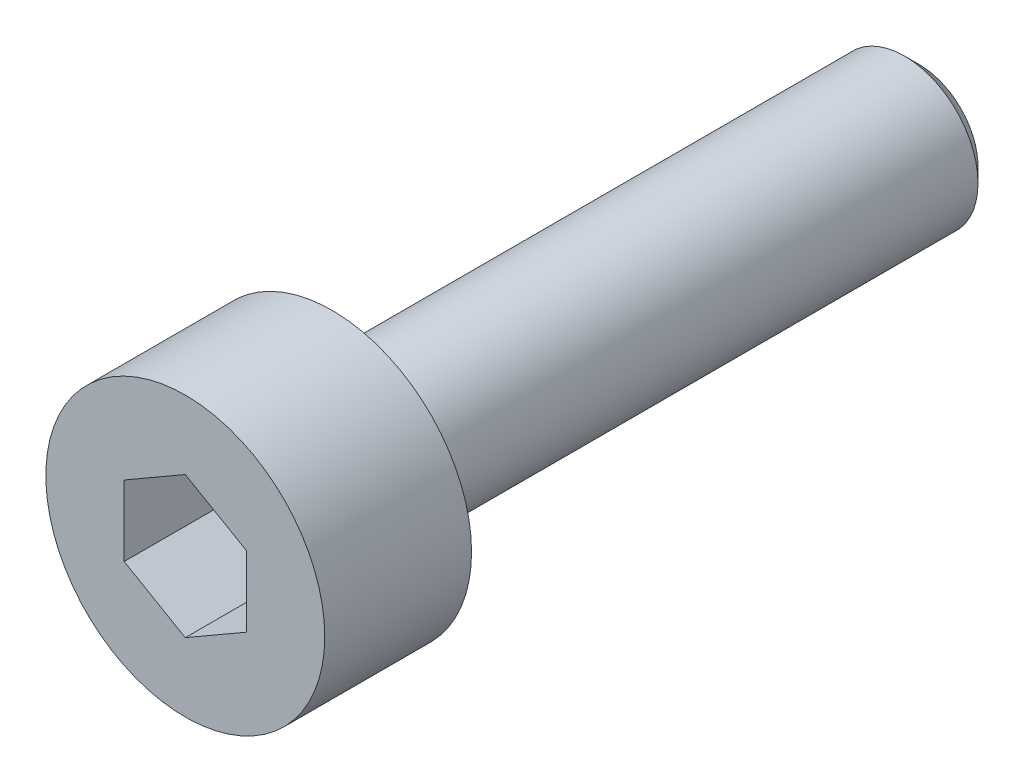
ISO-10303-21;
HEADER;
FILE_DESCRIPTION(('STEP AP214'),'2;1');
FILE_NAME('part.step','',(''),(''),'','','');
FILE_SCHEMA(('AUTOMOTIVE_DESIGN { 1 0 10303 214 1 1 1 1 }'));
ENDSEC;
DATA;
#1=APPLICATION_CONTEXT('core data for automotive mechanical design processes');
#2=APPLICATION_PROTOCOL_DEFINITION('international standard','automotive_design',2000,#1);
#3=PRODUCT_CONTEXT('',#1,'mechanical');
#4=PRODUCT('Part','Part','',(#3));
#5=PRODUCT_RELATED_PRODUCT_CATEGORY('part','',(#4));
#6=PRODUCT_DEFINITION_FORMATION('','',#4);
#7=PRODUCT_DEFINITION_CONTEXT('part definition',#1,'design');
#8=PRODUCT_DEFINITION('design','',#6,#7);
#9=PRODUCT_DEFINITION_SHAPE('','',#8);
#10=(LENGTH_UNIT() NAMED_UNIT(*) SI_UNIT(.MILLI.,.METRE.));
#11=(NAMED_UNIT(*) PLANE_ANGLE_UNIT() SI_UNIT($,.RADIAN.));
#12=(NAMED_UNIT(*) SI_UNIT($,.STERADIAN.) SOLID_ANGLE_UNIT());
#13=UNCERTAINTY_MEASURE_WITH_UNIT(LENGTH_MEASURE(1.E-05),#10,'distance_accuracy_value','');
#14=(GEOMETRIC_REPRESENTATION_CONTEXT(3) GLOBAL_UNCERTAINTY_ASSIGNED_CONTEXT((#13)) GLOBAL_UNIT_ASSIGNED_CONTEXT((#10,
#11,#12)) REPRESENTATION_CONTEXT('',''));
#15=CARTESIAN_POINT('',(0.,0.,0.));
#16=DIRECTION('',(0.,0.,1.));
#17=DIRECTION('',(1.,0.,0.));
#18=AXIS2_PLACEMENT_3D('',#15,#16,#17);
#19=CARTESIAN_POINT('',(0.,0.,0.));
#20=DIRECTION('',(0.,0.,1.));
#21=DIRECTION('',(1.,0.,0.));
#22=AXIS2_PLACEMENT_3D('',#19,#20,#21);
#23=PLANE('',#22);
#24=CARTESIAN_POINT('',(0.,0.,0.));
#25=DIRECTION('',(0.,0.,1.));
#26=DIRECTION('',(1.,0.,0.));
#27=AXIS2_PLACEMENT_3D('',#24,#25,#26);
#28=CIRCLE('',#27,2.85);
#29=CARTESIAN_POINT('',(2.85,0.,0.));
#30=VERTEX_POINT('',#29);
#31=EDGE_CURVE('E140',#30,#30,#28,.T.);
#32=ORIENTED_EDGE('',*,*,#31,.F.);
#33=EDGE_LOOP('',(#32));
#34=FACE_BOUND('',#33,.T.);
#35=CARTESIAN_POINT('',(0.,0.,0.));
#36=DIRECTION('',(0.,0.,1.));
#37=DIRECTION('',(1.,0.,0.));
#38=AXIS2_PLACEMENT_3D('',#35,#36,#37);
#39=CIRCLE('',#38,1.5);
#40=CARTESIAN_POINT('',(1.5,0.,0.));
#41=VERTEX_POINT('',#40);
#42=EDGE_CURVE('E149',#41,#41,#39,.F.);
#43=ORIENTED_EDGE('',*,*,#42,.F.);
#44=EDGE_LOOP('',(#43));
#45=FACE_BOUND('',#44,.T.);
#46=ADVANCED_FACE('F38',(#34,#45),#23,.F.);
#47=CARTESIAN_POINT('',(0.,0.,3.));
#48=DIRECTION('',(0.,0.,-1.));
#49=DIRECTION('',(-1.,0.,0.));
#50=AXIS2_PLACEMENT_3D('',#47,#48,#49);
#51=CYLINDRICAL_SURFACE('',#50,2.85);
#52=CARTESIAN_POINT('',(0.,0.,3.));
#53=DIRECTION('',(0.,0.,1.));
#54=DIRECTION('',(1.,0.,0.));
#55=AXIS2_PLACEMENT_3D('',#52,#53,#54);
#56=CIRCLE('',#55,2.85);
#57=CARTESIAN_POINT('',(2.85,0.,3.));
#58=VERTEX_POINT('',#57);
#59=EDGE_CURVE('E146',#58,#58,#56,.T.);
#60=ORIENTED_EDGE('',*,*,#59,.F.);
#61=EDGE_LOOP('',(#60));
#62=FACE_BOUND('',#61,.T.);
#63=ORIENTED_EDGE('',*,*,#31,.T.);
#64=EDGE_LOOP('',(#63));
#65=FACE_BOUND('',#64,.T.);
#66=ADVANCED_FACE('F171',(#62,#65),#51,.T.);
#67=CARTESIAN_POINT('',(0.,0.,3.));
#68=DIRECTION('',(0.,0.,1.));
#69=DIRECTION('',(1.,0.,0.));
#70=AXIS2_PLACEMENT_3D('',#67,#68,#69);
#71=PLANE('',#70);
#72=DIRECTION('',(-0.866025403784439,0.5,0.));
#73=VECTOR('',#72,1.);
#74=CARTESIAN_POINT('',(1.25,0.721687836487032,3.));
#75=LINE('',#74,#73);
#76=CARTESIAN_POINT('',(1.25,0.721687836487032,3.));
#77=VERTEX_POINT('',#76);
#78=CARTESIAN_POINT('',(0.,1.44337567297406,3.));
#79=VERTEX_POINT('',#78);
#80=EDGE_CURVE('E53',#77,#79,#75,.T.);
#81=ORIENTED_EDGE('',*,*,#80,.F.);
#82=DIRECTION('',(0.,1.,0.));
#83=VECTOR('',#82,1.);
#84=CARTESIAN_POINT('',(1.25,-0.721687836487032,3.));
#85=LINE('',#84,#83);
#86=CARTESIAN_POINT('',(1.25,-0.721687836487032,3.));
#87=VERTEX_POINT('',#86);
#88=EDGE_CURVE('E136',#87,#77,#85,.T.);
#89=ORIENTED_EDGE('',*,*,#88,.F.);
#90=DIRECTION('',(0.866025403784439,0.5,0.));
#91=VECTOR('',#90,1.);
#92=CARTESIAN_POINT('',(0.,-1.44337567297406,3.));
#93=LINE('',#92,#91);
#94=CARTESIAN_POINT('',(0.,-1.44337567297406,3.));
#95=VERTEX_POINT('',#94);
#96=EDGE_CURVE('E134',#95,#87,#93,.T.);
#97=ORIENTED_EDGE('',*,*,#96,.F.);
#98=DIRECTION('',(0.866025403784439,-0.5,0.));
#99=VECTOR('',#98,1.);
#100=CARTESIAN_POINT('',(-1.25,-0.721687836487033,3.));
#101=LINE('',#100,#99);
#102=CARTESIAN_POINT('',(-1.25,-0.721687836487033,3.));
#103=VERTEX_POINT('',#102);
#104=EDGE_CURVE('E101',#103,#95,#101,.T.);
#105=ORIENTED_EDGE('',*,*,#104,.F.);
#106=DIRECTION('',(0.,-1.,0.));
#107=VECTOR('',#106,1.);
#108=CARTESIAN_POINT('',(-1.25,0.721687836487032,3.));
#109=LINE('',#108,#107);
#110=CARTESIAN_POINT('',(-1.25,0.721687836487032,3.));
#111=VERTEX_POINT('',#110);
#112=EDGE_CURVE('E130',#111,#103,#109,.T.);
#113=ORIENTED_EDGE('',*,*,#112,.F.);
#114=DIRECTION('',(-0.866025403784439,-0.5,0.));
#115=VECTOR('',#114,1.);
#116=CARTESIAN_POINT('',(0.,1.44337567297406,3.));
#117=LINE('',#116,#115);
#118=EDGE_CURVE('E127',#79,#111,#117,.T.);
#119=ORIENTED_EDGE('',*,*,#118,.F.);
#120=EDGE_LOOP('',(#81,#89,#97,#105,#113,#119));
#121=FACE_BOUND('',#120,.T.);
#122=ORIENTED_EDGE('',*,*,#59,.T.);
#123=EDGE_LOOP('',(#122));
#124=FACE_BOUND('',#123,.T.);
#125=ADVANCED_FACE('F177',(#121,#124),#71,.T.);
#126=CARTESIAN_POINT('',(0.,0.,-12.));
#127=DIRECTION('',(0.,0.,1.));
#128=DIRECTION('',(1.,0.,0.));
#129=AXIS2_PLACEMENT_3D('',#126,#127,#128);
#130=CYLINDRICAL_SURFACE('',#129,1.5);
#131=CARTESIAN_POINT('',(0.,0.,-11.7));
#132=DIRECTION('',(0.,0.,-1.));
#133=DIRECTION('',(-1.,0.,0.));
#134=AXIS2_PLACEMENT_3D('',#131,#132,#133);
#135=CIRCLE('',#134,1.5);
#136=CARTESIAN_POINT('',(-1.5,0.,-11.7));
#137=VERTEX_POINT('',#136);
#138=EDGE_CURVE('E11',#137,#137,#135,.F.);
#139=ORIENTED_EDGE('',*,*,#138,.T.);
#140=EDGE_LOOP('',(#139));
#141=FACE_BOUND('',#140,.T.);
#142=ORIENTED_EDGE('',*,*,#42,.T.);
#143=EDGE_LOOP('',(#142));
#144=FACE_BOUND('',#143,.T.);
#145=ADVANCED_FACE('F167',(#141,#144),#130,.T.);
#146=CARTESIAN_POINT('',(0.,0.,-12.));
#147=DIRECTION('',(0.,0.,-1.));
#148=DIRECTION('',(-1.,0.,0.));
#149=AXIS2_PLACEMENT_3D('',#146,#147,#148);
#150=PLANE('',#149);
#151=CARTESIAN_POINT('',(0.,0.,-12.));
#152=DIRECTION('',(0.,0.,-1.));
#153=DIRECTION('',(-1.,0.,0.));
#154=AXIS2_PLACEMENT_3D('',#151,#152,#153);
#155=CIRCLE('',#154,1.2);
#156=CARTESIAN_POINT('',(-1.2,0.,-12.));
#157=VERTEX_POINT('',#156);
#158=EDGE_CURVE('E46',#157,#157,#155,.T.);
#159=ORIENTED_EDGE('',*,*,#158,.T.);
#160=EDGE_LOOP('',(#159));
#161=FACE_BOUND('',#160,.T.);
#162=ADVANCED_FACE('F156',(#161),#150,.T.);
#163=CARTESIAN_POINT('',(0.,0.,-12.));
#164=DIRECTION('',(0.,0.,1.));
#165=DIRECTION('',(1.,0.,0.));
#166=AXIS2_PLACEMENT_3D('',#163,#164,#165);
#167=CONICAL_SURFACE('',#166,1.2,0.785398163397444);
#168=ORIENTED_EDGE('',*,*,#138,.F.);
#169=EDGE_LOOP('',(#168));
#170=FACE_BOUND('',#169,.T.);
#171=ORIENTED_EDGE('',*,*,#158,.F.);
#172=EDGE_LOOP('',(#171));
#173=FACE_BOUND('',#172,.T.);
#174=ADVANCED_FACE('F40',(#170,#173),#167,.T.);
#175=CARTESIAN_POINT('',(1.25,0.721687836487032,1.));
#176=DIRECTION('',(0.5,0.866025403784439,0.));
#177=DIRECTION('',(-0.866025403784439,0.5,0.));
#178=AXIS2_PLACEMENT_3D('',#175,#176,#177);
#179=PLANE('',#178);
#180=ORIENTED_EDGE('',*,*,#80,.T.);
#181=DIRECTION('',(0.,0.,1.));
#182=VECTOR('',#181,1.);
#183=CARTESIAN_POINT('',(0.,1.44337567297406,1.));
#184=LINE('',#183,#182);
#185=CARTESIAN_POINT('',(0.,1.44337567297406,1.));
#186=VERTEX_POINT('',#185);
#187=EDGE_CURVE('E83',#186,#79,#184,.T.);
#188=ORIENTED_EDGE('',*,*,#187,.F.);
#189=DIRECTION('',(-0.866025403784439,0.5,0.));
#190=VECTOR('',#189,1.);
#191=CARTESIAN_POINT('',(1.25,0.721687836487032,1.));
#192=LINE('',#191,#190);
#193=CARTESIAN_POINT('',(1.25,0.721687836487032,1.));
#194=VERTEX_POINT('',#193);
#195=EDGE_CURVE('E138',#194,#186,#192,.T.);
#196=ORIENTED_EDGE('',*,*,#195,.F.);
#197=DIRECTION('',(0.,0.,1.));
#198=VECTOR('',#197,1.);
#199=CARTESIAN_POINT('',(1.25,0.721687836487032,1.));
#200=LINE('',#199,#198);
#201=EDGE_CURVE('E61',#194,#77,#200,.T.);
#202=ORIENTED_EDGE('',*,*,#201,.T.);
#203=EDGE_LOOP('',(#180,#188,#196,#202));
#204=FACE_BOUND('',#203,.T.);
#205=ADVANCED_FACE('F159',(#204),#179,.F.);
#206=CARTESIAN_POINT('',(1.25,-0.721687836487032,1.));
#207=DIRECTION('',(1.,0.,0.));
#208=DIRECTION('',(0.,1.,0.));
#209=AXIS2_PLACEMENT_3D('',#206,#207,#208);
#210=PLANE('',#209);
#211=ORIENTED_EDGE('',*,*,#88,.T.);
#212=ORIENTED_EDGE('',*,*,#201,.F.);
#213=DIRECTION('',(0.,1.,0.));
#214=VECTOR('',#213,1.);
#215=CARTESIAN_POINT('',(1.25,-0.721687836487032,1.));
#216=LINE('',#215,#214);
#217=CARTESIAN_POINT('',(1.25,-0.721687836487032,1.));
#218=VERTEX_POINT('',#217);
#219=EDGE_CURVE('E113',#218,#194,#216,.T.);
#220=ORIENTED_EDGE('',*,*,#219,.F.);
#221=DIRECTION('',(0.,0.,1.));
#222=VECTOR('',#221,1.);
#223=CARTESIAN_POINT('',(1.25,-0.721687836487032,1.));
#224=LINE('',#223,#222);
#225=EDGE_CURVE('E105',#218,#87,#224,.T.);
#226=ORIENTED_EDGE('',*,*,#225,.T.);
#227=EDGE_LOOP('',(#211,#212,#220,#226));
#228=FACE_BOUND('',#227,.T.);
#229=ADVANCED_FACE('F165',(#228),#210,.F.);
#230=CARTESIAN_POINT('',(0.,-1.44337567297406,1.));
#231=DIRECTION('',(0.5,-0.866025403784439,0.));
#232=DIRECTION('',(0.866025403784439,0.5,0.));
#233=AXIS2_PLACEMENT_3D('',#230,#231,#232);
#234=PLANE('',#233);
#235=ORIENTED_EDGE('',*,*,#96,.T.);
#236=ORIENTED_EDGE('',*,*,#225,.F.);
#237=DIRECTION('',(0.866025403784439,0.5,0.));
#238=VECTOR('',#237,1.);
#239=CARTESIAN_POINT('',(0.,-1.44337567297406,1.));
#240=LINE('',#239,#238);
#241=CARTESIAN_POINT('',(0.,-1.44337567297406,1.));
#242=VERTEX_POINT('',#241);
#243=EDGE_CURVE('E109',#242,#218,#240,.T.);
#244=ORIENTED_EDGE('',*,*,#243,.F.);
#245=DIRECTION('',(0.,0.,1.));
#246=VECTOR('',#245,1.);
#247=CARTESIAN_POINT('',(0.,-1.44337567297406,1.));
#248=LINE('',#247,#246);
#249=EDGE_CURVE('E94',#242,#95,#248,.T.);
#250=ORIENTED_EDGE('',*,*,#249,.T.);
#251=EDGE_LOOP('',(#235,#236,#244,#250));
#252=FACE_BOUND('',#251,.T.);
#253=ADVANCED_FACE('F110',(#252),#234,.F.);
#254=CARTESIAN_POINT('',(-1.25,-0.721687836487033,1.));
#255=DIRECTION('',(-0.5,-0.866025403784439,0.));
#256=DIRECTION('',(0.866025403784439,-0.5,0.));
#257=AXIS2_PLACEMENT_3D('',#254,#255,#256);
#258=PLANE('',#257);
#259=ORIENTED_EDGE('',*,*,#104,.T.);
#260=ORIENTED_EDGE('',*,*,#249,.F.);
#261=DIRECTION('',(0.866025403784439,-0.5,0.));
#262=VECTOR('',#261,1.);
#263=CARTESIAN_POINT('',(-1.25,-0.721687836487033,1.));
#264=LINE('',#263,#262);
#265=CARTESIAN_POINT('',(-1.25,-0.721687836487033,1.));
#266=VERTEX_POINT('',#265);
#267=EDGE_CURVE('E98',#266,#242,#264,.T.);
#268=ORIENTED_EDGE('',*,*,#267,.F.);
#269=DIRECTION('',(0.,0.,1.));
#270=VECTOR('',#269,1.);
#271=CARTESIAN_POINT('',(-1.25,-0.721687836487033,1.));
#272=LINE('',#271,#270);
#273=EDGE_CURVE('E106',#266,#103,#272,.T.);
#274=ORIENTED_EDGE('',*,*,#273,.T.);
#275=EDGE_LOOP('',(#259,#260,#268,#274));
#276=FACE_BOUND('',#275,.T.);
#277=ADVANCED_FACE('F96',(#276),#258,.F.);
#278=CARTESIAN_POINT('',(-1.25,0.721687836487032,1.));
#279=DIRECTION('',(-1.,0.,0.));
#280=DIRECTION('',(0.,0.,1.));
#281=AXIS2_PLACEMENT_3D('',#278,#279,#280);
#282=PLANE('',#281);
#283=ORIENTED_EDGE('',*,*,#112,.T.);
#284=ORIENTED_EDGE('',*,*,#273,.F.);
#285=DIRECTION('',(0.,-1.,0.));
#286=VECTOR('',#285,1.);
#287=CARTESIAN_POINT('',(-1.25,0.721687836487032,1.));
#288=LINE('',#287,#286);
#289=CARTESIAN_POINT('',(-1.25,0.721687836487032,1.));
#290=VERTEX_POINT('',#289);
#291=EDGE_CURVE('E119',#290,#266,#288,.T.);
#292=ORIENTED_EDGE('',*,*,#291,.F.);
#293=DIRECTION('',(0.,0.,1.));
#294=VECTOR('',#293,1.);
#295=CARTESIAN_POINT('',(-1.25,0.721687836487032,1.));
#296=LINE('',#295,#294);
#297=EDGE_CURVE('E143',#290,#111,#296,.T.);
#298=ORIENTED_EDGE('',*,*,#297,.T.);
#299=EDGE_LOOP('',(#283,#284,#292,#298));
#300=FACE_BOUND('',#299,.T.);
#301=ADVANCED_FACE('F191',(#300),#282,.F.);
#302=CARTESIAN_POINT('',(0.,1.44337567297406,1.));
#303=DIRECTION('',(-0.5,0.866025403784439,0.));
#304=DIRECTION('',(-0.866025403784439,-0.5,0.));
#305=AXIS2_PLACEMENT_3D('',#302,#303,#304);
#306=PLANE('',#305);
#307=ORIENTED_EDGE('',*,*,#118,.T.);
#308=ORIENTED_EDGE('',*,*,#297,.F.);
#309=DIRECTION('',(-0.866025403784439,-0.5,0.));
#310=VECTOR('',#309,1.);
#311=CARTESIAN_POINT('',(0.,1.44337567297406,1.));
#312=LINE('',#311,#310);
#313=EDGE_CURVE('E121',#186,#290,#312,.T.);
#314=ORIENTED_EDGE('',*,*,#313,.F.);
#315=ORIENTED_EDGE('',*,*,#187,.T.);
#316=EDGE_LOOP('',(#307,#308,#314,#315));
#317=FACE_BOUND('',#316,.T.);
#318=ADVANCED_FACE('F188',(#317),#306,.F.);
#319=CARTESIAN_POINT('',(0.,0.,1.));
#320=DIRECTION('',(0.,0.,1.));
#321=DIRECTION('',(1.,0.,0.));
#322=AXIS2_PLACEMENT_3D('',#319,#320,#321);
#323=PLANE('',#322);
#324=ORIENTED_EDGE('',*,*,#195,.T.);
#325=ORIENTED_EDGE('',*,*,#313,.T.);
#326=ORIENTED_EDGE('',*,*,#291,.T.);
#327=ORIENTED_EDGE('',*,*,#267,.T.);
#328=ORIENTED_EDGE('',*,*,#243,.T.);
#329=ORIENTED_EDGE('',*,*,#219,.T.);
#330=EDGE_LOOP('',(#324,#325,#326,#327,#328,#329));
#331=FACE_BOUND('',#330,.T.);
#332=ADVANCED_FACE('F116',(#331),#323,.T.);
#333=CLOSED_SHELL('',(#46,#66,#125,#145,#162,#174,#205,#229,#253,#277,#301,#318,#332));
#334=MANIFOLD_SOLID_BREP('B2',#333);
#335=ADVANCED_BREP_SHAPE_REPRESENTATION('',(#18,#334),#14);
#336=SHAPE_DEFINITION_REPRESENTATION(#9,#335);
ENDSEC;
END-ISO-10303-21;
